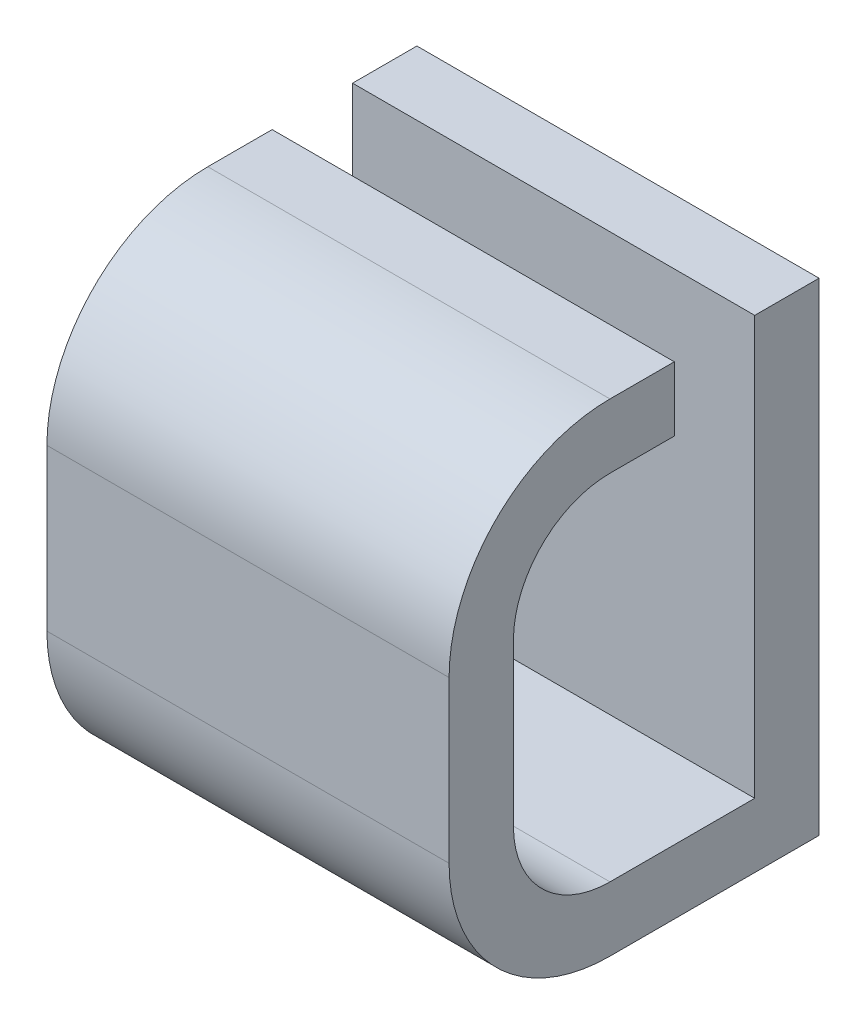
ISO-10303-21;
HEADER;
FILE_DESCRIPTION(('STEP AP214'),'2;1');
FILE_NAME('part.step','',(''),(''),'','','');
FILE_SCHEMA(('AUTOMOTIVE_DESIGN { 1 0 10303 214 1 1 1 1 }'));
ENDSEC;
DATA;
#1=APPLICATION_CONTEXT('core data for automotive mechanical design processes');
#2=APPLICATION_PROTOCOL_DEFINITION('international standard','automotive_design',2000,#1);
#3=PRODUCT_CONTEXT('',#1,'mechanical');
#4=PRODUCT('Part','Part','',(#3));
#5=PRODUCT_RELATED_PRODUCT_CATEGORY('part','',(#4));
#6=PRODUCT_DEFINITION_FORMATION('','',#4);
#7=PRODUCT_DEFINITION_CONTEXT('part definition',#1,'design');
#8=PRODUCT_DEFINITION('design','',#6,#7);
#9=PRODUCT_DEFINITION_SHAPE('','',#8);
#10=(LENGTH_UNIT() NAMED_UNIT(*) SI_UNIT(.MILLI.,.METRE.));
#11=(NAMED_UNIT(*) PLANE_ANGLE_UNIT() SI_UNIT($,.RADIAN.));
#12=(NAMED_UNIT(*) SI_UNIT($,.STERADIAN.) SOLID_ANGLE_UNIT());
#13=UNCERTAINTY_MEASURE_WITH_UNIT(LENGTH_MEASURE(1.E-05),#10,'distance_accuracy_value','');
#14=(GEOMETRIC_REPRESENTATION_CONTEXT(3) GLOBAL_UNCERTAINTY_ASSIGNED_CONTEXT((#13)) GLOBAL_UNIT_ASSIGNED_CONTEXT((#10,
#11,#12)) REPRESENTATION_CONTEXT('',''));
#15=CARTESIAN_POINT('',(0.,0.,0.));
#16=DIRECTION('',(0.,0.,1.));
#17=DIRECTION('',(1.,0.,0.));
#18=AXIS2_PLACEMENT_3D('',#15,#16,#17);
#19=CARTESIAN_POINT('',(5.,8.50907418876824,3.8186661795348));
#20=DIRECTION('',(0.,-1.,0.));
#21=DIRECTION('',(0.,0.,-1.));
#22=AXIS2_PLACEMENT_3D('',#19,#20,#21);
#23=PLANE('',#22);
#24=DIRECTION('',(0.,0.,1.));
#25=VECTOR('',#24,1.);
#26=CARTESIAN_POINT('',(0.,8.50907418876824,3.8186661795348));
#27=LINE('',#26,#25);
#28=CARTESIAN_POINT('',(0.,8.50907418876824,3.0186661795348));
#29=VERTEX_POINT('',#28);
#30=CARTESIAN_POINT('',(0.,8.50907418876824,3.8186661795348));
#31=VERTEX_POINT('',#30);
#32=EDGE_CURVE('E167',#29,#31,#27,.T.);
#33=ORIENTED_EDGE('',*,*,#32,.T.);
#34=DIRECTION('',(-1.,0.,0.));
#35=VECTOR('',#34,1.);
#36=CARTESIAN_POINT('',(5.,8.50907418876824,3.8186661795348));
#37=LINE('',#36,#35);
#38=CARTESIAN_POINT('',(5.,8.50907418876824,3.8186661795348));
#39=VERTEX_POINT('',#38);
#40=EDGE_CURVE('E11',#39,#31,#37,.T.);
#41=ORIENTED_EDGE('',*,*,#40,.F.);
#42=DIRECTION('',(0.,0.,1.));
#43=VECTOR('',#42,1.);
#44=CARTESIAN_POINT('',(5.,8.50907418876824,3.8186661795348));
#45=LINE('',#44,#43);
#46=CARTESIAN_POINT('',(5.,8.50907418876824,3.0186661795348));
#47=VERTEX_POINT('',#46);
#48=EDGE_CURVE('E193',#47,#39,#45,.T.);
#49=ORIENTED_EDGE('',*,*,#48,.F.);
#50=DIRECTION('',(-1.,0.,0.));
#51=VECTOR('',#50,1.);
#52=CARTESIAN_POINT('',(5.,8.50907418876824,3.0186661795348));
#53=LINE('',#52,#51);
#54=EDGE_CURVE('E163',#47,#29,#53,.T.);
#55=ORIENTED_EDGE('',*,*,#54,.T.);
#56=EDGE_LOOP('',(#33,#41,#49,#55));
#57=FACE_BOUND('',#56,.T.);
#58=ADVANCED_FACE('F35',(#57),#23,.F.);
#59=CARTESIAN_POINT('',(5.,8.50907418876824,3.8186661795348));
#60=DIRECTION('',(0.,0.,-1.));
#61=DIRECTION('',(-1.,0.,0.));
#62=AXIS2_PLACEMENT_3D('',#59,#60,#61);
#63=PLANE('',#62);
#64=DIRECTION('',(0.,-1.,0.));
#65=VECTOR('',#64,1.);
#66=CARTESIAN_POINT('',(0.,8.50907418876824,3.8186661795348));
#67=LINE('',#66,#65);
#68=CARTESIAN_POINT('',(0.,3.30907418876824,3.8186661795348));
#69=VERTEX_POINT('',#68);
#70=EDGE_CURVE('E170',#31,#69,#67,.T.);
#71=ORIENTED_EDGE('',*,*,#70,.T.);
#72=DIRECTION('',(-1.,0.,0.));
#73=VECTOR('',#72,1.);
#74=CARTESIAN_POINT('',(5.,3.30907418876824,3.8186661795348));
#75=LINE('',#74,#73);
#76=CARTESIAN_POINT('',(5.,3.30907418876824,3.8186661795348));
#77=VERTEX_POINT('',#76);
#78=EDGE_CURVE('E43',#77,#69,#75,.T.);
#79=ORIENTED_EDGE('',*,*,#78,.F.);
#80=DIRECTION('',(0.,-1.,0.));
#81=VECTOR('',#80,1.);
#82=CARTESIAN_POINT('',(5.,8.50907418876824,3.8186661795348));
#83=LINE('',#82,#81);
#84=EDGE_CURVE('E112',#39,#77,#83,.T.);
#85=ORIENTED_EDGE('',*,*,#84,.F.);
#86=ORIENTED_EDGE('',*,*,#40,.T.);
#87=EDGE_LOOP('',(#71,#79,#85,#86));
#88=FACE_BOUND('',#87,.T.);
#89=ADVANCED_FACE('F281',(#88),#63,.F.);
#90=CARTESIAN_POINT('',(5.,3.30907418876824,3.8186661795348));
#91=DIRECTION('',(0.,-1.,0.));
#92=DIRECTION('',(0.,0.,-1.));
#93=AXIS2_PLACEMENT_3D('',#90,#91,#92);
#94=PLANE('',#93);
#95=DIRECTION('',(0.,0.,1.));
#96=VECTOR('',#95,1.);
#97=CARTESIAN_POINT('',(0.,3.30907418876824,3.8186661795348));
#98=LINE('',#97,#96);
#99=CARTESIAN_POINT('',(0.,3.30907418876824,5.6186661795348));
#100=VERTEX_POINT('',#99);
#101=EDGE_CURVE('E172',#69,#100,#98,.T.);
#102=ORIENTED_EDGE('',*,*,#101,.T.);
#103=DIRECTION('',(-1.,0.,0.));
#104=VECTOR('',#103,1.);
#105=CARTESIAN_POINT('',(5.,3.30907418876824,5.6186661795348));
#106=LINE('',#105,#104);
#107=CARTESIAN_POINT('',(5.,3.30907418876824,5.6186661795348));
#108=VERTEX_POINT('',#107);
#109=EDGE_CURVE('E218',#108,#100,#106,.T.);
#110=ORIENTED_EDGE('',*,*,#109,.F.);
#111=DIRECTION('',(0.,0.,1.));
#112=VECTOR('',#111,1.);
#113=CARTESIAN_POINT('',(5.,3.30907418876824,3.8186661795348));
#114=LINE('',#113,#112);
#115=EDGE_CURVE('E226',#77,#108,#114,.T.);
#116=ORIENTED_EDGE('',*,*,#115,.F.);
#117=ORIENTED_EDGE('',*,*,#78,.T.);
#118=EDGE_LOOP('',(#102,#110,#116,#117));
#119=FACE_BOUND('',#118,.T.);
#120=ADVANCED_FACE('F224',(#119),#94,.F.);
#121=CARTESIAN_POINT('',(5.,4.50907418876824,5.6186661795348));
#122=DIRECTION('',(-1.,0.,0.));
#123=DIRECTION('',(0.,0.,1.));
#124=AXIS2_PLACEMENT_3D('',#121,#122,#123);
#125=CYLINDRICAL_SURFACE('',#124,1.2);
#126=CARTESIAN_POINT('',(0.,4.50907418876824,5.6186661795348));
#127=DIRECTION('',(-1.,0.,0.));
#128=DIRECTION('',(0.,0.,1.));
#129=AXIS2_PLACEMENT_3D('',#126,#127,#128);
#130=CIRCLE('',#129,1.2);
#131=CARTESIAN_POINT('',(0.,4.50907418876824,6.8186661795348));
#132=VERTEX_POINT('',#131);
#133=EDGE_CURVE('E174',#100,#132,#130,.T.);
#134=ORIENTED_EDGE('',*,*,#133,.T.);
#135=DIRECTION('',(-1.,0.,0.));
#136=VECTOR('',#135,1.);
#137=CARTESIAN_POINT('',(5.,4.50907418876824,6.8186661795348));
#138=LINE('',#137,#136);
#139=CARTESIAN_POINT('',(5.,4.50907418876824,6.8186661795348));
#140=VERTEX_POINT('',#139);
#141=EDGE_CURVE('E215',#140,#132,#138,.T.);
#142=ORIENTED_EDGE('',*,*,#141,.F.);
#143=CARTESIAN_POINT('',(5.,4.50907418876824,5.6186661795348));
#144=DIRECTION('',(-1.,0.,0.));
#145=DIRECTION('',(0.,0.,1.));
#146=AXIS2_PLACEMENT_3D('',#143,#144,#145);
#147=CIRCLE('',#146,1.2);
#148=EDGE_CURVE('E244',#108,#140,#147,.T.);
#149=ORIENTED_EDGE('',*,*,#148,.F.);
#150=ORIENTED_EDGE('',*,*,#109,.T.);
#151=EDGE_LOOP('',(#134,#142,#149,#150));
#152=FACE_BOUND('',#151,.T.);
#153=ADVANCED_FACE('F235',(#152),#125,.F.);
#154=CARTESIAN_POINT('',(5.,4.50907418876824,6.8186661795348));
#155=DIRECTION('',(0.,0.,1.));
#156=DIRECTION('',(1.,0.,0.));
#157=AXIS2_PLACEMENT_3D('',#154,#155,#156);
#158=PLANE('',#157);
#159=DIRECTION('',(0.,1.,0.));
#160=VECTOR('',#159,1.);
#161=CARTESIAN_POINT('',(0.,4.50907418876824,6.8186661795348));
#162=LINE('',#161,#160);
#163=CARTESIAN_POINT('',(0.,6.50907418876824,6.8186661795348));
#164=VERTEX_POINT('',#163);
#165=EDGE_CURVE('E176',#132,#164,#162,.T.);
#166=ORIENTED_EDGE('',*,*,#165,.T.);
#167=DIRECTION('',(-1.,0.,0.));
#168=VECTOR('',#167,1.);
#169=CARTESIAN_POINT('',(5.,6.50907418876824,6.8186661795348));
#170=LINE('',#169,#168);
#171=CARTESIAN_POINT('',(5.,6.50907418876824,6.8186661795348));
#172=VERTEX_POINT('',#171);
#173=EDGE_CURVE('E212',#172,#164,#170,.T.);
#174=ORIENTED_EDGE('',*,*,#173,.F.);
#175=DIRECTION('',(0.,1.,0.));
#176=VECTOR('',#175,1.);
#177=CARTESIAN_POINT('',(5.,4.50907418876824,6.8186661795348));
#178=LINE('',#177,#176);
#179=EDGE_CURVE('E241',#140,#172,#178,.T.);
#180=ORIENTED_EDGE('',*,*,#179,.F.);
#181=ORIENTED_EDGE('',*,*,#141,.T.);
#182=EDGE_LOOP('',(#166,#174,#180,#181));
#183=FACE_BOUND('',#182,.T.);
#184=ADVANCED_FACE('F239',(#183),#158,.F.);
#185=CARTESIAN_POINT('',(5.,6.50907418876824,5.6186661795348));
#186=DIRECTION('',(-1.,0.,0.));
#187=DIRECTION('',(0.,0.,1.));
#188=AXIS2_PLACEMENT_3D('',#185,#186,#187);
#189=CYLINDRICAL_SURFACE('',#188,1.2);
#190=CARTESIAN_POINT('',(0.,6.50907418876824,5.6186661795348));
#191=DIRECTION('',(-1.,0.,0.));
#192=DIRECTION('',(0.,0.,1.));
#193=AXIS2_PLACEMENT_3D('',#190,#191,#192);
#194=CIRCLE('',#193,1.2);
#195=CARTESIAN_POINT('',(0.,7.70907418876824,5.6186661795348));
#196=VERTEX_POINT('',#195);
#197=EDGE_CURVE('E178',#164,#196,#194,.T.);
#198=ORIENTED_EDGE('',*,*,#197,.T.);
#199=DIRECTION('',(-1.,0.,0.));
#200=VECTOR('',#199,1.);
#201=CARTESIAN_POINT('',(5.,7.70907418876824,5.6186661795348));
#202=LINE('',#201,#200);
#203=CARTESIAN_POINT('',(5.,7.70907418876824,5.6186661795348));
#204=VERTEX_POINT('',#203);
#205=EDGE_CURVE('E209',#204,#196,#202,.T.);
#206=ORIENTED_EDGE('',*,*,#205,.F.);
#207=CARTESIAN_POINT('',(5.,6.50907418876824,5.6186661795348));
#208=DIRECTION('',(-1.,0.,0.));
#209=DIRECTION('',(0.,0.,1.));
#210=AXIS2_PLACEMENT_3D('',#207,#208,#209);
#211=CIRCLE('',#210,1.2);
#212=EDGE_CURVE('E243',#172,#204,#211,.T.);
#213=ORIENTED_EDGE('',*,*,#212,.F.);
#214=ORIENTED_EDGE('',*,*,#173,.T.);
#215=EDGE_LOOP('',(#198,#206,#213,#214));
#216=FACE_BOUND('',#215,.T.);
#217=ADVANCED_FACE('F294',(#216),#189,.F.);
#218=CARTESIAN_POINT('',(5.,7.70907418876824,5.6186661795348));
#219=DIRECTION('',(0.,1.,0.));
#220=DIRECTION('',(0.,0.,1.));
#221=AXIS2_PLACEMENT_3D('',#218,#219,#220);
#222=PLANE('',#221);
#223=DIRECTION('',(0.,0.,-1.));
#224=VECTOR('',#223,1.);
#225=CARTESIAN_POINT('',(0.,7.70907418876824,5.6186661795348));
#226=LINE('',#225,#224);
#227=CARTESIAN_POINT('',(0.,7.70907418876824,4.8186661795348));
#228=VERTEX_POINT('',#227);
#229=EDGE_CURVE('E180',#196,#228,#226,.T.);
#230=ORIENTED_EDGE('',*,*,#229,.T.);
#231=DIRECTION('',(-1.,0.,0.));
#232=VECTOR('',#231,1.);
#233=CARTESIAN_POINT('',(5.,7.70907418876824,4.8186661795348));
#234=LINE('',#233,#232);
#235=CARTESIAN_POINT('',(5.,7.70907418876824,4.8186661795348));
#236=VERTEX_POINT('',#235);
#237=EDGE_CURVE('E206',#236,#228,#234,.T.);
#238=ORIENTED_EDGE('',*,*,#237,.F.);
#239=DIRECTION('',(0.,0.,-1.));
#240=VECTOR('',#239,1.);
#241=CARTESIAN_POINT('',(5.,7.70907418876824,5.6186661795348));
#242=LINE('',#241,#240);
#243=EDGE_CURVE('E246',#204,#236,#242,.T.);
#244=ORIENTED_EDGE('',*,*,#243,.F.);
#245=ORIENTED_EDGE('',*,*,#205,.T.);
#246=EDGE_LOOP('',(#230,#238,#244,#245));
#247=FACE_BOUND('',#246,.T.);
#248=ADVANCED_FACE('F297',(#247),#222,.F.);
#249=CARTESIAN_POINT('',(5.,8.50907418876824,4.8186661795348));
#250=DIRECTION('',(0.,0.,1.));
#251=DIRECTION('',(1.,0.,0.));
#252=AXIS2_PLACEMENT_3D('',#249,#250,#251);
#253=PLANE('',#252);
#254=DIRECTION('',(0.,1.,0.));
#255=VECTOR('',#254,1.);
#256=CARTESIAN_POINT('',(0.,8.50907418876824,4.8186661795348));
#257=LINE('',#256,#255);
#258=CARTESIAN_POINT('',(0.,8.50907418876824,4.8186661795348));
#259=VERTEX_POINT('',#258);
#260=EDGE_CURVE('E182',#228,#259,#257,.T.);
#261=ORIENTED_EDGE('',*,*,#260,.T.);
#262=DIRECTION('',(-1.,0.,0.));
#263=VECTOR('',#262,1.);
#264=CARTESIAN_POINT('',(5.,8.50907418876824,4.8186661795348));
#265=LINE('',#264,#263);
#266=CARTESIAN_POINT('',(5.,8.50907418876824,4.8186661795348));
#267=VERTEX_POINT('',#266);
#268=EDGE_CURVE('E203',#267,#259,#265,.T.);
#269=ORIENTED_EDGE('',*,*,#268,.F.);
#270=DIRECTION('',(0.,1.,0.));
#271=VECTOR('',#270,1.);
#272=CARTESIAN_POINT('',(5.,8.50907418876824,4.8186661795348));
#273=LINE('',#272,#271);
#274=EDGE_CURVE('E252',#236,#267,#273,.T.);
#275=ORIENTED_EDGE('',*,*,#274,.F.);
#276=ORIENTED_EDGE('',*,*,#237,.T.);
#277=EDGE_LOOP('',(#261,#269,#275,#276));
#278=FACE_BOUND('',#277,.T.);
#279=ADVANCED_FACE('F301',(#278),#253,.F.);
#280=CARTESIAN_POINT('',(5.,8.50907418876824,5.6186661795348));
#281=DIRECTION('',(0.,-1.,0.));
#282=DIRECTION('',(0.,0.,-1.));
#283=AXIS2_PLACEMENT_3D('',#280,#281,#282);
#284=PLANE('',#283);
#285=DIRECTION('',(0.,0.,1.));
#286=VECTOR('',#285,1.);
#287=CARTESIAN_POINT('',(0.,8.50907418876824,5.6186661795348));
#288=LINE('',#287,#286);
#289=CARTESIAN_POINT('',(0.,8.50907418876824,5.6186661795348));
#290=VERTEX_POINT('',#289);
#291=EDGE_CURVE('E184',#259,#290,#288,.T.);
#292=ORIENTED_EDGE('',*,*,#291,.T.);
#293=DIRECTION('',(-1.,0.,0.));
#294=VECTOR('',#293,1.);
#295=CARTESIAN_POINT('',(5.,8.50907418876824,5.6186661795348));
#296=LINE('',#295,#294);
#297=CARTESIAN_POINT('',(5.,8.50907418876824,5.6186661795348));
#298=VERTEX_POINT('',#297);
#299=EDGE_CURVE('E200',#298,#290,#296,.T.);
#300=ORIENTED_EDGE('',*,*,#299,.F.);
#301=DIRECTION('',(0.,0.,1.));
#302=VECTOR('',#301,1.);
#303=CARTESIAN_POINT('',(5.,8.50907418876824,5.6186661795348));
#304=LINE('',#303,#302);
#305=EDGE_CURVE('E254',#267,#298,#304,.T.);
#306=ORIENTED_EDGE('',*,*,#305,.F.);
#307=ORIENTED_EDGE('',*,*,#268,.T.);
#308=EDGE_LOOP('',(#292,#300,#306,#307));
#309=FACE_BOUND('',#308,.T.);
#310=ADVANCED_FACE('F305',(#309),#284,.F.);
#311=CARTESIAN_POINT('',(5.,6.50907418876824,5.6186661795348));
#312=DIRECTION('',(-1.,0.,0.));
#313=DIRECTION('',(0.,0.,1.));
#314=AXIS2_PLACEMENT_3D('',#311,#312,#313);
#315=CYLINDRICAL_SURFACE('',#314,2.);
#316=CARTESIAN_POINT('',(0.,6.50907418876824,5.6186661795348));
#317=DIRECTION('',(1.,0.,0.));
#318=DIRECTION('',(0.,0.,1.));
#319=AXIS2_PLACEMENT_3D('',#316,#317,#318);
#320=CIRCLE('',#319,2.);
#321=CARTESIAN_POINT('',(0.,6.50907418876824,7.6186661795348));
#322=VERTEX_POINT('',#321);
#323=EDGE_CURVE('E186',#290,#322,#320,.T.);
#324=ORIENTED_EDGE('',*,*,#323,.T.);
#325=DIRECTION('',(-1.,0.,0.));
#326=VECTOR('',#325,1.);
#327=CARTESIAN_POINT('',(5.,6.50907418876824,7.6186661795348));
#328=LINE('',#327,#326);
#329=CARTESIAN_POINT('',(5.,6.50907418876824,7.6186661795348));
#330=VERTEX_POINT('',#329);
#331=EDGE_CURVE('E197',#330,#322,#328,.T.);
#332=ORIENTED_EDGE('',*,*,#331,.F.);
#333=CARTESIAN_POINT('',(5.,6.50907418876824,5.6186661795348));
#334=DIRECTION('',(1.,0.,0.));
#335=DIRECTION('',(0.,0.,1.));
#336=AXIS2_PLACEMENT_3D('',#333,#334,#335);
#337=CIRCLE('',#336,2.);
#338=EDGE_CURVE('E256',#298,#330,#337,.T.);
#339=ORIENTED_EDGE('',*,*,#338,.F.);
#340=ORIENTED_EDGE('',*,*,#299,.T.);
#341=EDGE_LOOP('',(#324,#332,#339,#340));
#342=FACE_BOUND('',#341,.T.);
#343=ADVANCED_FACE('F262',(#342),#315,.T.);
#344=CARTESIAN_POINT('',(5.,4.50907418876824,7.6186661795348));
#345=DIRECTION('',(0.,0.,-1.));
#346=DIRECTION('',(-1.,0.,0.));
#347=AXIS2_PLACEMENT_3D('',#344,#345,#346);
#348=PLANE('',#347);
#349=DIRECTION('',(0.,-1.,0.));
#350=VECTOR('',#349,1.);
#351=CARTESIAN_POINT('',(0.,4.50907418876824,7.6186661795348));
#352=LINE('',#351,#350);
#353=CARTESIAN_POINT('',(0.,4.50907418876824,7.6186661795348));
#354=VERTEX_POINT('',#353);
#355=EDGE_CURVE('E188',#322,#354,#352,.T.);
#356=ORIENTED_EDGE('',*,*,#355,.T.);
#357=DIRECTION('',(-1.,0.,0.));
#358=VECTOR('',#357,1.);
#359=CARTESIAN_POINT('',(5.,4.50907418876824,7.6186661795348));
#360=LINE('',#359,#358);
#361=CARTESIAN_POINT('',(5.,4.50907418876824,7.6186661795348));
#362=VERTEX_POINT('',#361);
#363=EDGE_CURVE('E158',#362,#354,#360,.T.);
#364=ORIENTED_EDGE('',*,*,#363,.F.);
#365=DIRECTION('',(0.,-1.,0.));
#366=VECTOR('',#365,1.);
#367=CARTESIAN_POINT('',(5.,4.50907418876824,7.6186661795348));
#368=LINE('',#367,#366);
#369=EDGE_CURVE('E149',#330,#362,#368,.T.);
#370=ORIENTED_EDGE('',*,*,#369,.F.);
#371=ORIENTED_EDGE('',*,*,#331,.T.);
#372=EDGE_LOOP('',(#356,#364,#370,#371));
#373=FACE_BOUND('',#372,.T.);
#374=ADVANCED_FACE('F266',(#373),#348,.F.);
#375=CARTESIAN_POINT('',(5.,4.50907418876824,5.6186661795348));
#376=DIRECTION('',(-1.,0.,0.));
#377=DIRECTION('',(0.,0.,1.));
#378=AXIS2_PLACEMENT_3D('',#375,#376,#377);
#379=CYLINDRICAL_SURFACE('',#378,2.);
#380=CARTESIAN_POINT('',(0.,4.50907418876824,5.6186661795348));
#381=DIRECTION('',(1.,0.,0.));
#382=DIRECTION('',(0.,0.,1.));
#383=AXIS2_PLACEMENT_3D('',#380,#381,#382);
#384=CIRCLE('',#383,2.);
#385=CARTESIAN_POINT('',(0.,2.50907418876824,5.6186661795348));
#386=VERTEX_POINT('',#385);
#387=EDGE_CURVE('E157',#354,#386,#384,.T.);
#388=ORIENTED_EDGE('',*,*,#387,.T.);
#389=DIRECTION('',(-1.,0.,0.));
#390=VECTOR('',#389,1.);
#391=CARTESIAN_POINT('',(5.,2.50907418876824,5.6186661795348));
#392=LINE('',#391,#390);
#393=CARTESIAN_POINT('',(5.,2.50907418876824,5.6186661795348));
#394=VERTEX_POINT('',#393);
#395=EDGE_CURVE('E154',#394,#386,#392,.T.);
#396=ORIENTED_EDGE('',*,*,#395,.F.);
#397=CARTESIAN_POINT('',(5.,4.50907418876824,5.6186661795348));
#398=DIRECTION('',(1.,0.,0.));
#399=DIRECTION('',(0.,0.,1.));
#400=AXIS2_PLACEMENT_3D('',#397,#398,#399);
#401=CIRCLE('',#400,2.);
#402=EDGE_CURVE('E143',#362,#394,#401,.T.);
#403=ORIENTED_EDGE('',*,*,#402,.F.);
#404=ORIENTED_EDGE('',*,*,#363,.T.);
#405=EDGE_LOOP('',(#388,#396,#403,#404));
#406=FACE_BOUND('',#405,.T.);
#407=ADVANCED_FACE('F155',(#406),#379,.T.);
#408=CARTESIAN_POINT('',(5.,2.50907418876824,3.0186661795348));
#409=DIRECTION('',(0.,1.,0.));
#410=DIRECTION('',(0.,0.,1.));
#411=AXIS2_PLACEMENT_3D('',#408,#409,#410);
#412=PLANE('',#411);
#413=DIRECTION('',(0.,0.,-1.));
#414=VECTOR('',#413,1.);
#415=CARTESIAN_POINT('',(0.,2.50907418876824,3.0186661795348));
#416=LINE('',#415,#414);
#417=CARTESIAN_POINT('',(0.,2.50907418876824,3.0186661795348));
#418=VERTEX_POINT('',#417);
#419=EDGE_CURVE('E98',#386,#418,#416,.T.);
#420=ORIENTED_EDGE('',*,*,#419,.T.);
#421=DIRECTION('',(-1.,0.,0.));
#422=VECTOR('',#421,1.);
#423=CARTESIAN_POINT('',(5.,2.50907418876824,3.0186661795348));
#424=LINE('',#423,#422);
#425=CARTESIAN_POINT('',(5.,2.50907418876824,3.0186661795348));
#426=VERTEX_POINT('',#425);
#427=EDGE_CURVE('E159',#426,#418,#424,.T.);
#428=ORIENTED_EDGE('',*,*,#427,.F.);
#429=DIRECTION('',(0.,0.,-1.));
#430=VECTOR('',#429,1.);
#431=CARTESIAN_POINT('',(5.,2.50907418876824,3.0186661795348));
#432=LINE('',#431,#430);
#433=EDGE_CURVE('E147',#394,#426,#432,.T.);
#434=ORIENTED_EDGE('',*,*,#433,.F.);
#435=ORIENTED_EDGE('',*,*,#395,.T.);
#436=EDGE_LOOP('',(#420,#428,#434,#435));
#437=FACE_BOUND('',#436,.T.);
#438=ADVANCED_FACE('F161',(#437),#412,.F.);
#439=CARTESIAN_POINT('',(5.,8.50907418876824,3.0186661795348));
#440=DIRECTION('',(0.,0.,1.));
#441=DIRECTION('',(1.,0.,0.));
#442=AXIS2_PLACEMENT_3D('',#439,#440,#441);
#443=PLANE('',#442);
#444=DIRECTION('',(0.,1.,0.));
#445=VECTOR('',#444,1.);
#446=CARTESIAN_POINT('',(0.,8.50907418876824,3.0186661795348));
#447=LINE('',#446,#445);
#448=EDGE_CURVE('E104',#418,#29,#447,.T.);
#449=ORIENTED_EDGE('',*,*,#448,.T.);
#450=ORIENTED_EDGE('',*,*,#54,.F.);
#451=DIRECTION('',(0.,1.,0.));
#452=VECTOR('',#451,1.);
#453=CARTESIAN_POINT('',(5.,8.50907418876824,3.0186661795348));
#454=LINE('',#453,#452);
#455=EDGE_CURVE('E51',#426,#47,#454,.T.);
#456=ORIENTED_EDGE('',*,*,#455,.F.);
#457=ORIENTED_EDGE('',*,*,#427,.T.);
#458=EDGE_LOOP('',(#449,#450,#456,#457));
#459=FACE_BOUND('',#458,.T.);
#460=ADVANCED_FACE('F270',(#459),#443,.F.);
#461=CARTESIAN_POINT('',(5.,4.50907418876824,5.6186661795348));
#462=DIRECTION('',(-1.,0.,0.));
#463=DIRECTION('',(0.,0.,1.));
#464=AXIS2_PLACEMENT_3D('',#461,#462,#463);
#465=PLANE('',#464);
#466=ORIENTED_EDGE('',*,*,#48,.T.);
#467=ORIENTED_EDGE('',*,*,#84,.T.);
#468=ORIENTED_EDGE('',*,*,#115,.T.);
#469=ORIENTED_EDGE('',*,*,#148,.T.);
#470=ORIENTED_EDGE('',*,*,#179,.T.);
#471=ORIENTED_EDGE('',*,*,#212,.T.);
#472=ORIENTED_EDGE('',*,*,#243,.T.);
#473=ORIENTED_EDGE('',*,*,#274,.T.);
#474=ORIENTED_EDGE('',*,*,#305,.T.);
#475=ORIENTED_EDGE('',*,*,#338,.T.);
#476=ORIENTED_EDGE('',*,*,#369,.T.);
#477=ORIENTED_EDGE('',*,*,#402,.T.);
#478=ORIENTED_EDGE('',*,*,#433,.T.);
#479=ORIENTED_EDGE('',*,*,#455,.T.);
#480=EDGE_LOOP('',(#466,#467,#468,#469,#470,#471,#472,#473,#474,#475,#476,#477,#478,#479));
#481=FACE_BOUND('',#480,.T.);
#482=ADVANCED_FACE('F145',(#481),#465,.F.);
#483=CARTESIAN_POINT('',(0.,4.50907418876824,5.6186661795348));
#484=DIRECTION('',(-1.,0.,0.));
#485=DIRECTION('',(0.,0.,1.));
#486=AXIS2_PLACEMENT_3D('',#483,#484,#485);
#487=PLANE('',#486);
#488=ORIENTED_EDGE('',*,*,#32,.F.);
#489=ORIENTED_EDGE('',*,*,#448,.F.);
#490=ORIENTED_EDGE('',*,*,#419,.F.);
#491=ORIENTED_EDGE('',*,*,#387,.F.);
#492=ORIENTED_EDGE('',*,*,#355,.F.);
#493=ORIENTED_EDGE('',*,*,#323,.F.);
#494=ORIENTED_EDGE('',*,*,#291,.F.);
#495=ORIENTED_EDGE('',*,*,#260,.F.);
#496=ORIENTED_EDGE('',*,*,#229,.F.);
#497=ORIENTED_EDGE('',*,*,#197,.F.);
#498=ORIENTED_EDGE('',*,*,#165,.F.);
#499=ORIENTED_EDGE('',*,*,#133,.F.);
#500=ORIENTED_EDGE('',*,*,#101,.F.);
#501=ORIENTED_EDGE('',*,*,#70,.F.);
#502=EDGE_LOOP('',(#488,#489,#490,#491,#492,#493,#494,#495,#496,#497,#498,#499,#500,#501));
#503=FACE_BOUND('',#502,.T.);
#504=ADVANCED_FACE('F230',(#503),#487,.T.);
#505=CLOSED_SHELL('',(#58,#89,#120,#153,#184,#217,#248,#279,#310,#343,#374,#407,#438,#460,#482,#504));
#506=MANIFOLD_SOLID_BREP('B2',#505);
#507=ADVANCED_BREP_SHAPE_REPRESENTATION('',(#18,#506),#14);
#508=SHAPE_DEFINITION_REPRESENTATION(#9,#507);
ENDSEC;
END-ISO-10303-21;
